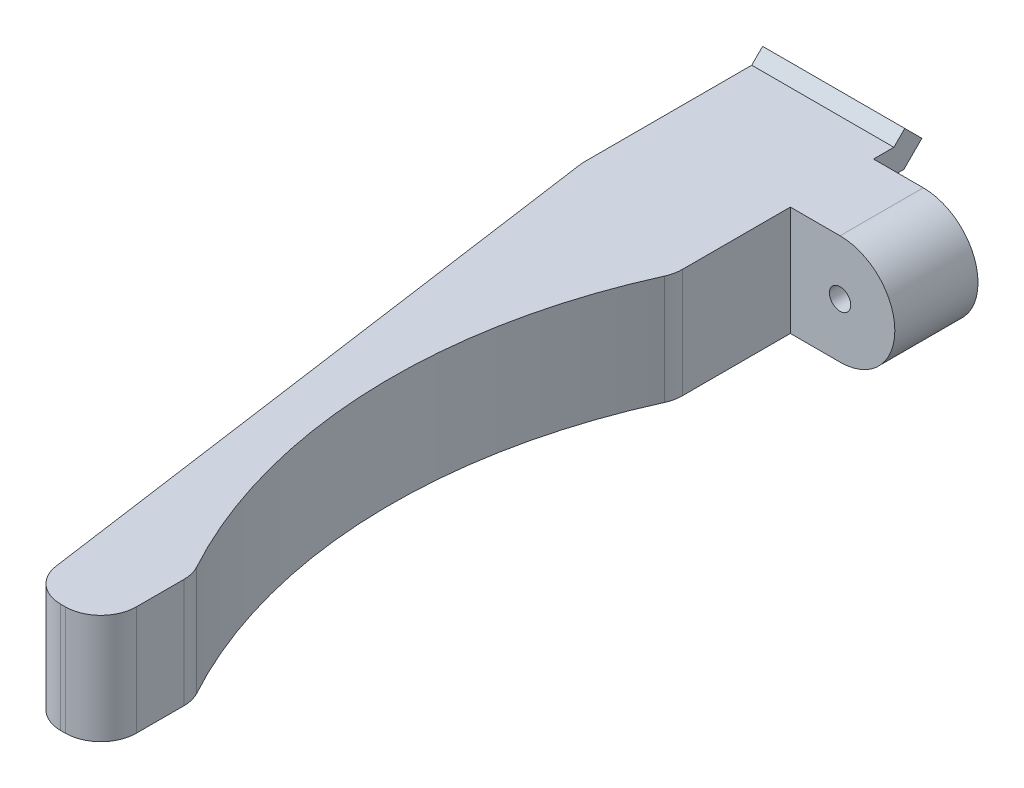
ISO-10303-21;
HEADER;
FILE_DESCRIPTION(('STEP AP214'),'2;1');
FILE_NAME('part.step','',(''),(''),'','','');
FILE_SCHEMA(('AUTOMOTIVE_DESIGN { 1 0 10303 214 1 1 1 1 }'));
ENDSEC;
DATA;
#1=APPLICATION_CONTEXT('core data for automotive mechanical design processes');
#2=APPLICATION_PROTOCOL_DEFINITION('international standard','automotive_design',2000,#1);
#3=PRODUCT_CONTEXT('',#1,'mechanical');
#4=PRODUCT('Part','Part','',(#3));
#5=PRODUCT_RELATED_PRODUCT_CATEGORY('part','',(#4));
#6=PRODUCT_DEFINITION_FORMATION('','',#4);
#7=PRODUCT_DEFINITION_CONTEXT('part definition',#1,'design');
#8=PRODUCT_DEFINITION('design','',#6,#7);
#9=PRODUCT_DEFINITION_SHAPE('','',#8);
#10=(LENGTH_UNIT() NAMED_UNIT(*) SI_UNIT(.MILLI.,.METRE.));
#11=(NAMED_UNIT(*) PLANE_ANGLE_UNIT() SI_UNIT($,.RADIAN.));
#12=(NAMED_UNIT(*) SI_UNIT($,.STERADIAN.) SOLID_ANGLE_UNIT());
#13=UNCERTAINTY_MEASURE_WITH_UNIT(LENGTH_MEASURE(1.E-05),#10,'distance_accuracy_value','');
#14=(GEOMETRIC_REPRESENTATION_CONTEXT(3) GLOBAL_UNCERTAINTY_ASSIGNED_CONTEXT((#13)) GLOBAL_UNIT_ASSIGNED_CONTEXT((#10,
#11,#12)) REPRESENTATION_CONTEXT('',''));
#15=CARTESIAN_POINT('',(0.,0.,0.));
#16=DIRECTION('',(0.,0.,1.));
#17=DIRECTION('',(1.,0.,0.));
#18=AXIS2_PLACEMENT_3D('',#15,#16,#17);
#19=CARTESIAN_POINT('',(5.,-7.38420621970652,-2.5));
#20=DIRECTION('',(-1.,0.,0.));
#21=DIRECTION('',(0.,0.,-1.));
#22=AXIS2_PLACEMENT_3D('',#19,#20,#21);
#23=PLANE('',#22);
#24=DIRECTION('',(0.,-1.,0.));
#25=VECTOR('',#24,1.);
#26=CARTESIAN_POINT('',(4.99999999999998,-2.80336880465984,-2.5));
#27=LINE('',#26,#25);
#28=CARTESIAN_POINT('',(5.,4.89663119534016,-2.5));
#29=VERTEX_POINT('',#28);
#30=CARTESIAN_POINT('',(5.,3.19663119534017,-2.5));
#31=VERTEX_POINT('',#30);
#32=EDGE_CURVE('E395',#29,#31,#27,.T.);
#33=ORIENTED_EDGE('',*,*,#32,.T.);
#34=DIRECTION('',(0.,0.,1.));
#35=VECTOR('',#34,1.);
#36=CARTESIAN_POINT('',(5.,3.19663119534017,-2.5));
#37=LINE('',#36,#35);
#38=CARTESIAN_POINT('',(5.,3.19663119534016,-4.63786796564135));
#39=VERTEX_POINT('',#38);
#40=EDGE_CURVE('E266',#39,#31,#37,.T.);
#41=ORIENTED_EDGE('',*,*,#40,.F.);
#42=DIRECTION('',(0.,-0.707106781186547,0.707106781186548));
#43=VECTOR('',#42,1.);
#44=CARTESIAN_POINT('',(5.,4.46084475771326,-5.90208152801444));
#45=LINE('',#44,#43);
#46=CARTESIAN_POINT('',(5.,4.46084475771326,-5.90208152801444));
#47=VERTEX_POINT('',#46);
#48=EDGE_CURVE('E263',#47,#39,#45,.T.);
#49=ORIENTED_EDGE('',*,*,#48,.F.);
#50=DIRECTION('',(0.,-0.707106781186548,-0.707106781186547));
#51=VECTOR('',#50,1.);
#52=CARTESIAN_POINT('',(5.,5.66292628573039,-4.69999999999731));
#53=LINE('',#52,#51);
#54=CARTESIAN_POINT('',(5.,5.66292628573039,-4.69999999999731));
#55=VERTEX_POINT('',#54);
#56=EDGE_CURVE('E260',#55,#47,#53,.T.);
#57=ORIENTED_EDGE('',*,*,#56,.F.);
#58=DIRECTION('',(0.,0.707106781186547,-0.707106781186547));
#59=VECTOR('',#58,1.);
#60=CARTESIAN_POINT('',(5.,4.89663119534016,-3.93370490960709));
#61=LINE('',#60,#59);
#62=CARTESIAN_POINT('',(5.,4.89663119534016,-3.93370490960709));
#63=VERTEX_POINT('',#62);
#64=EDGE_CURVE('E257',#63,#55,#61,.T.);
#65=ORIENTED_EDGE('',*,*,#64,.F.);
#66=DIRECTION('',(0.,0.,-1.));
#67=VECTOR('',#66,1.);
#68=CARTESIAN_POINT('',(5.,4.89663119534016,-2.64999999999731));
#69=LINE('',#68,#67);
#70=EDGE_CURVE('E239',#29,#63,#69,.T.);
#71=ORIENTED_EDGE('',*,*,#70,.F.);
#72=EDGE_LOOP('',(#33,#41,#49,#57,#65,#71));
#73=FACE_BOUND('',#72,.T.);
#74=ADVANCED_FACE('F37',(#73),#23,.F.);
#75=CARTESIAN_POINT('',(5.,-1.10336880465984,-2.5));
#76=VERTEX_POINT('',#75);
#77=CARTESIAN_POINT('',(5.,-2.80336880465984,-2.49999999999994));
#78=VERTEX_POINT('',#77);
#79=EDGE_CURVE('E386',#76,#78,#27,.T.);
#80=ORIENTED_EDGE('',*,*,#79,.T.);
#81=DIRECTION('',(0.,0.,1.));
#82=VECTOR('',#81,1.);
#83=CARTESIAN_POINT('',(5.,-2.80336880465984,-2.49999999999994));
#84=LINE('',#83,#82);
#85=CARTESIAN_POINT('',(5.,-2.80336880465984,-4.63786796564128));
#86=VERTEX_POINT('',#85);
#87=EDGE_CURVE('E217',#86,#78,#84,.T.);
#88=ORIENTED_EDGE('',*,*,#87,.F.);
#89=DIRECTION('',(0.,-0.707106781186547,0.707106781186548));
#90=VECTOR('',#89,1.);
#91=CARTESIAN_POINT('',(5.,-1.53915524228674,-5.90208152801438));
#92=LINE('',#91,#90);
#93=CARTESIAN_POINT('',(5.,-1.53915524228674,-5.90208152801438));
#94=VERTEX_POINT('',#93);
#95=EDGE_CURVE('E218',#94,#86,#92,.T.);
#96=ORIENTED_EDGE('',*,*,#95,.F.);
#97=DIRECTION('',(0.,-0.707106781186548,-0.707106781186547));
#98=VECTOR('',#97,1.);
#99=CARTESIAN_POINT('',(5.,-0.337073714269612,-4.69999999999725));
#100=LINE('',#99,#98);
#101=CARTESIAN_POINT('',(5.,-0.337073714269612,-4.69999999999725));
#102=VERTEX_POINT('',#101);
#103=EDGE_CURVE('E223',#102,#94,#100,.T.);
#104=ORIENTED_EDGE('',*,*,#103,.F.);
#105=DIRECTION('',(0.,0.707106781186547,-0.707106781186547));
#106=VECTOR('',#105,1.);
#107=CARTESIAN_POINT('',(5.,-1.10336880465984,-3.93370490960702));
#108=LINE('',#107,#106);
#109=CARTESIAN_POINT('',(5.,-1.10336880465984,-3.93370490960702));
#110=VERTEX_POINT('',#109);
#111=EDGE_CURVE('E360',#110,#102,#108,.T.);
#112=ORIENTED_EDGE('',*,*,#111,.F.);
#113=DIRECTION('',(0.,0.,-1.));
#114=VECTOR('',#113,1.);
#115=CARTESIAN_POINT('',(5.,-1.10336880465984,-2.64999999999725));
#116=LINE('',#115,#114);
#117=EDGE_CURVE('E342',#76,#110,#116,.T.);
#118=ORIENTED_EDGE('',*,*,#117,.F.);
#119=EDGE_LOOP('',(#80,#88,#96,#104,#112,#118));
#120=FACE_BOUND('',#119,.T.);
#121=ADVANCED_FACE('F371',(#120),#23,.F.);
#122=CARTESIAN_POINT('',(0.,0.,-2.5));
#123=DIRECTION('',(0.,0.,1.));
#124=DIRECTION('',(-1.,0.,0.));
#125=AXIS2_PLACEMENT_3D('',#122,#123,#124);
#126=PLANE('',#125);
#127=DIRECTION('',(0.,-1.,0.));
#128=VECTOR('',#127,1.);
#129=CARTESIAN_POINT('',(-5.,-7.38420621970652,-2.5));
#130=LINE('',#129,#128);
#131=CARTESIAN_POINT('',(-5.,3.19663119534017,-2.5));
#132=VERTEX_POINT('',#131);
#133=CARTESIAN_POINT('',(-5.,-1.10336880465984,-2.5));
#134=VERTEX_POINT('',#133);
#135=EDGE_CURVE('E280',#132,#134,#130,.T.);
#136=ORIENTED_EDGE('',*,*,#135,.F.);
#137=DIRECTION('',(1.,0.,0.));
#138=VECTOR('',#137,1.);
#139=CARTESIAN_POINT('',(-9.20199597764443,3.19663119534017,-2.5));
#140=LINE('',#139,#138);
#141=EDGE_CURVE('E245',#132,#31,#140,.T.);
#142=ORIENTED_EDGE('',*,*,#141,.T.);
#143=ORIENTED_EDGE('',*,*,#32,.F.);
#144=DIRECTION('',(-1.,0.,0.));
#145=VECTOR('',#144,1.);
#146=CARTESIAN_POINT('',(5.,4.89663119534016,-2.5));
#147=LINE('',#146,#145);
#148=CARTESIAN_POINT('',(8.49999999999998,4.89663119534016,-2.5));
#149=VERTEX_POINT('',#148);
#150=EDGE_CURVE('E213',#149,#29,#147,.T.);
#151=ORIENTED_EDGE('',*,*,#150,.F.);
#152=CARTESIAN_POINT('',(8.49999999999998,1.04663119534016,-2.5));
#153=DIRECTION('',(0.,0.,1.));
#154=DIRECTION('',(-1.,0.,0.));
#155=AXIS2_PLACEMENT_3D('',#152,#153,#154);
#156=CIRCLE('',#155,3.85);
#157=CARTESIAN_POINT('',(8.49999999999998,-2.80336880465984,-2.5));
#158=VERTEX_POINT('',#157);
#159=EDGE_CURVE('E406',#158,#149,#156,.T.);
#160=ORIENTED_EDGE('',*,*,#159,.F.);
#161=DIRECTION('',(1.,0.,0.));
#162=VECTOR('',#161,1.);
#163=CARTESIAN_POINT('',(8.49999999999999,-2.80336880465984,-2.5));
#164=LINE('',#163,#162);
#165=EDGE_CURVE('E394',#78,#158,#164,.T.);
#166=ORIENTED_EDGE('',*,*,#165,.F.);
#167=ORIENTED_EDGE('',*,*,#79,.F.);
#168=DIRECTION('',(1.,0.,0.));
#169=VECTOR('',#168,1.);
#170=CARTESIAN_POINT('',(-9.20199597764443,-1.10336880465984,-2.49999999999994));
#171=LINE('',#170,#169);
#172=EDGE_CURVE('E221',#134,#76,#171,.T.);
#173=ORIENTED_EDGE('',*,*,#172,.F.);
#174=EDGE_LOOP('',(#136,#142,#143,#151,#160,#166,#167,#173));
#175=FACE_BOUND('',#174,.T.);
#176=CARTESIAN_POINT('',(8.49999999999998,1.04663119534016,-2.5));
#177=DIRECTION('',(0.,0.,1.));
#178=DIRECTION('',(1.,0.,0.));
#179=AXIS2_PLACEMENT_3D('',#176,#177,#178);
#180=CIRCLE('',#179,0.75);
#181=CARTESIAN_POINT('',(9.24999999999998,1.04663119534016,-2.5));
#182=VERTEX_POINT('',#181);
#183=EDGE_CURVE('E400',#182,#182,#180,.T.);
#184=ORIENTED_EDGE('',*,*,#183,.T.);
#185=EDGE_LOOP('',(#184));
#186=FACE_BOUND('',#185,.T.);
#187=ADVANCED_FACE('F391',(#175,#186),#126,.F.);
#188=CARTESIAN_POINT('',(4.99999999999998,-2.80336880465984,3.35));
#189=VERTEX_POINT('',#188);
#190=CARTESIAN_POINT('',(5.,-2.80336880465987,10.9501334916828));
#191=VERTEX_POINT('',#190);
#192=EDGE_CURVE('E199',#189,#191,#84,.T.);
#193=ORIENTED_EDGE('',*,*,#192,.F.);
#194=DIRECTION('',(0.,-1.,0.));
#195=VECTOR('',#194,1.);
#196=CARTESIAN_POINT('',(4.99999999999998,-2.80336880465984,3.35));
#197=LINE('',#196,#195);
#198=CARTESIAN_POINT('',(5.,4.89663119534016,3.35));
#199=VERTEX_POINT('',#198);
#200=EDGE_CURVE('E204',#199,#189,#197,.T.);
#201=ORIENTED_EDGE('',*,*,#200,.F.);
#202=CARTESIAN_POINT('',(5.,4.89663119534016,10.9501334916829));
#203=VERTEX_POINT('',#202);
#204=EDGE_CURVE('E255',#203,#199,#69,.T.);
#205=ORIENTED_EDGE('',*,*,#204,.F.);
#206=DIRECTION('',(0.,1.,0.));
#207=VECTOR('',#206,1.);
#208=CARTESIAN_POINT('',(5.,4.89663119534017,10.9501334916829));
#209=LINE('',#208,#207);
#210=EDGE_CURVE('E11',#191,#203,#209,.T.);
#211=ORIENTED_EDGE('',*,*,#210,.F.);
#212=EDGE_LOOP('',(#193,#201,#205,#211));
#213=FACE_BOUND('',#212,.T.);
#214=ADVANCED_FACE('F216',(#213),#23,.F.);
#215=CARTESIAN_POINT('',(-5.,-7.38420621970652,-2.5));
#216=DIRECTION('',(1.,0.,0.));
#217=DIRECTION('',(0.,0.,1.));
#218=AXIS2_PLACEMENT_3D('',#215,#216,#217);
#219=PLANE('',#218);
#220=DIRECTION('',(0.,0.,1.));
#221=VECTOR('',#220,1.);
#222=CARTESIAN_POINT('',(-5.,4.89663119534016,-2.64999999999731));
#223=LINE('',#222,#221);
#224=CARTESIAN_POINT('',(-5.,4.89663119534016,-3.93370490960709));
#225=VERTEX_POINT('',#224);
#226=CARTESIAN_POINT('',(-5.,4.89663119534016,8.00000000000017));
#227=VERTEX_POINT('',#226);
#228=EDGE_CURVE('E254',#225,#227,#223,.T.);
#229=ORIENTED_EDGE('',*,*,#228,.F.);
#230=DIRECTION('',(0.,-0.707106781186548,0.707106781186548));
#231=VECTOR('',#230,1.);
#232=CARTESIAN_POINT('',(-5.,4.89663119534016,-3.93370490960709));
#233=LINE('',#232,#231);
#234=CARTESIAN_POINT('',(-5.,5.66292628573039,-4.69999999999731));
#235=VERTEX_POINT('',#234);
#236=EDGE_CURVE('E241',#235,#225,#233,.T.);
#237=ORIENTED_EDGE('',*,*,#236,.F.);
#238=DIRECTION('',(0.,0.707106781186548,0.707106781186547));
#239=VECTOR('',#238,1.);
#240=CARTESIAN_POINT('',(-5.,5.66292628573039,-4.69999999999731));
#241=LINE('',#240,#239);
#242=CARTESIAN_POINT('',(-5.,4.46084475771326,-5.90208152801444));
#243=VERTEX_POINT('',#242);
#244=EDGE_CURVE('E244',#243,#235,#241,.T.);
#245=ORIENTED_EDGE('',*,*,#244,.F.);
#246=DIRECTION('',(0.,0.707106781186547,-0.707106781186548));
#247=VECTOR('',#246,1.);
#248=CARTESIAN_POINT('',(-5.,4.46084475771326,-5.90208152801444));
#249=LINE('',#248,#247);
#250=CARTESIAN_POINT('',(-5.,3.19663119534017,-4.63786796564135));
#251=VERTEX_POINT('',#250);
#252=EDGE_CURVE('E248',#251,#243,#249,.T.);
#253=ORIENTED_EDGE('',*,*,#252,.F.);
#254=DIRECTION('',(0.,0.,-1.));
#255=VECTOR('',#254,1.);
#256=CARTESIAN_POINT('',(-5.,3.19663119534017,-2.5));
#257=LINE('',#256,#255);
#258=EDGE_CURVE('E251',#132,#251,#257,.T.);
#259=ORIENTED_EDGE('',*,*,#258,.F.);
#260=ORIENTED_EDGE('',*,*,#135,.T.);
#261=DIRECTION('',(0.,0.,1.));
#262=VECTOR('',#261,1.);
#263=CARTESIAN_POINT('',(-5.,-1.10336880465984,-2.64999999999725));
#264=LINE('',#263,#262);
#265=CARTESIAN_POINT('',(-5.,-1.10336880465984,-3.93370490960702));
#266=VERTEX_POINT('',#265);
#267=EDGE_CURVE('E237',#266,#134,#264,.T.);
#268=ORIENTED_EDGE('',*,*,#267,.F.);
#269=DIRECTION('',(0.,-0.707106781186548,0.707106781186548));
#270=VECTOR('',#269,1.);
#271=CARTESIAN_POINT('',(-5.,-1.10336880465984,-3.93370490960702));
#272=LINE('',#271,#270);
#273=CARTESIAN_POINT('',(-5.,-0.337073714269613,-4.69999999999725));
#274=VERTEX_POINT('',#273);
#275=EDGE_CURVE('E229',#274,#266,#272,.T.);
#276=ORIENTED_EDGE('',*,*,#275,.F.);
#277=DIRECTION('',(0.,0.707106781186548,0.707106781186547));
#278=VECTOR('',#277,1.);
#279=CARTESIAN_POINT('',(-5.,-0.337073714269612,-4.69999999999725));
#280=LINE('',#279,#278);
#281=CARTESIAN_POINT('',(-5.,-1.53915524228674,-5.90208152801438));
#282=VERTEX_POINT('',#281);
#283=EDGE_CURVE('E350',#282,#274,#280,.T.);
#284=ORIENTED_EDGE('',*,*,#283,.F.);
#285=DIRECTION('',(0.,0.707106781186547,-0.707106781186548));
#286=VECTOR('',#285,1.);
#287=CARTESIAN_POINT('',(-5.,-1.53915524228674,-5.90208152801438));
#288=LINE('',#287,#286);
#289=CARTESIAN_POINT('',(-5.,-2.80336880465984,-4.63786796564128));
#290=VERTEX_POINT('',#289);
#291=EDGE_CURVE('E353',#290,#282,#288,.T.);
#292=ORIENTED_EDGE('',*,*,#291,.F.);
#293=DIRECTION('',(0.,0.,-1.));
#294=VECTOR('',#293,1.);
#295=CARTESIAN_POINT('',(-5.,-2.80336880465984,-2.49999999999994));
#296=LINE('',#295,#294);
#297=CARTESIAN_POINT('',(-5.,-2.80336880465987,8.));
#298=VERTEX_POINT('',#297);
#299=EDGE_CURVE('E240',#298,#290,#296,.T.);
#300=ORIENTED_EDGE('',*,*,#299,.F.);
#301=DIRECTION('',(0.,-1.,0.));
#302=VECTOR('',#301,1.);
#303=CARTESIAN_POINT('',(-5.,56.8520738748096,8.00000000000017));
#304=LINE('',#303,#302);
#305=EDGE_CURVE('E325',#227,#298,#304,.T.);
#306=ORIENTED_EDGE('',*,*,#305,.F.);
#307=EDGE_LOOP('',(#229,#237,#245,#253,#259,#260,#268,#276,#284,#292,#300,#306));
#308=FACE_BOUND('',#307,.T.);
#309=ADVANCED_FACE('F380',(#308),#219,.F.);
#310=CARTESIAN_POINT('',(-9.20199597764443,3.19663119534017,-2.5));
#311=DIRECTION('',(0.,-1.,0.));
#312=DIRECTION('',(0.,0.,1.));
#313=AXIS2_PLACEMENT_3D('',#310,#311,#312);
#314=PLANE('',#313);
#315=ORIENTED_EDGE('',*,*,#258,.T.);
#316=DIRECTION('',(1.,0.,0.));
#317=VECTOR('',#316,1.);
#318=CARTESIAN_POINT('',(-9.20199597764443,3.19663119534016,-4.63786796564135));
#319=LINE('',#318,#317);
#320=EDGE_CURVE('E271',#251,#39,#319,.T.);
#321=ORIENTED_EDGE('',*,*,#320,.T.);
#322=ORIENTED_EDGE('',*,*,#40,.T.);
#323=ORIENTED_EDGE('',*,*,#141,.F.);
#324=EDGE_LOOP('',(#315,#321,#322,#323));
#325=FACE_BOUND('',#324,.T.);
#326=ADVANCED_FACE('F461',(#325),#314,.T.);
#327=CARTESIAN_POINT('',(-9.20199597764443,4.46084475771326,-5.90208152801444));
#328=DIRECTION('',(0.,-0.707106781186548,-0.707106781186547));
#329=DIRECTION('',(0.,-0.707106781186547,0.707106781186548));
#330=AXIS2_PLACEMENT_3D('',#327,#328,#329);
#331=PLANE('',#330);
#332=ORIENTED_EDGE('',*,*,#252,.T.);
#333=DIRECTION('',(1.,0.,0.));
#334=VECTOR('',#333,1.);
#335=CARTESIAN_POINT('',(-9.20199597764443,4.46084475771326,-5.90208152801444));
#336=LINE('',#335,#334);
#337=EDGE_CURVE('E273',#243,#47,#336,.T.);
#338=ORIENTED_EDGE('',*,*,#337,.T.);
#339=ORIENTED_EDGE('',*,*,#48,.T.);
#340=ORIENTED_EDGE('',*,*,#320,.F.);
#341=EDGE_LOOP('',(#332,#338,#339,#340));
#342=FACE_BOUND('',#341,.T.);
#343=ADVANCED_FACE('F475',(#342),#331,.T.);
#344=CARTESIAN_POINT('',(-9.20199597764443,5.66292628573039,-4.69999999999731));
#345=DIRECTION('',(0.,0.707106781186547,-0.707106781186548));
#346=DIRECTION('',(0.,-0.707106781186548,-0.707106781186547));
#347=AXIS2_PLACEMENT_3D('',#344,#345,#346);
#348=PLANE('',#347);
#349=ORIENTED_EDGE('',*,*,#244,.T.);
#350=DIRECTION('',(1.,0.,0.));
#351=VECTOR('',#350,1.);
#352=CARTESIAN_POINT('',(-9.20199597764443,5.66292628573039,-4.69999999999731));
#353=LINE('',#352,#351);
#354=EDGE_CURVE('E275',#235,#55,#353,.T.);
#355=ORIENTED_EDGE('',*,*,#354,.T.);
#356=ORIENTED_EDGE('',*,*,#56,.T.);
#357=ORIENTED_EDGE('',*,*,#337,.F.);
#358=EDGE_LOOP('',(#349,#355,#356,#357));
#359=FACE_BOUND('',#358,.T.);
#360=ADVANCED_FACE('F471',(#359),#348,.T.);
#361=CARTESIAN_POINT('',(-9.20199597764443,4.89663119534016,-3.93370490960709));
#362=DIRECTION('',(0.,0.707106781186547,0.707106781186547));
#363=DIRECTION('',(0.,0.707106781186548,-0.707106781186548));
#364=AXIS2_PLACEMENT_3D('',#361,#362,#363);
#365=PLANE('',#364);
#366=ORIENTED_EDGE('',*,*,#236,.T.);
#367=DIRECTION('',(1.,0.,0.));
#368=VECTOR('',#367,1.);
#369=CARTESIAN_POINT('',(-9.20199597764443,4.89663119534016,-3.93370490960709));
#370=LINE('',#369,#368);
#371=EDGE_CURVE('E269',#225,#63,#370,.T.);
#372=ORIENTED_EDGE('',*,*,#371,.T.);
#373=ORIENTED_EDGE('',*,*,#64,.T.);
#374=ORIENTED_EDGE('',*,*,#354,.F.);
#375=EDGE_LOOP('',(#366,#372,#373,#374));
#376=FACE_BOUND('',#375,.T.);
#377=ADVANCED_FACE('F468',(#376),#365,.T.);
#378=CARTESIAN_POINT('',(-9.20199597764443,4.89663119534016,-2.64999999999731));
#379=DIRECTION('',(0.,1.,0.));
#380=DIRECTION('',(0.,0.,-1.));
#381=AXIS2_PLACEMENT_3D('',#378,#379,#380);
#382=PLANE('',#381);
#383=DIRECTION('',(1.,0.,0.));
#384=VECTOR('',#383,1.);
#385=CARTESIAN_POINT('',(1.35244572854812,4.89663119534016,53.2));
#386=LINE('',#385,#384);
#387=CARTESIAN_POINT('',(3.52566257308868,4.89663119534016,53.2));
#388=VERTEX_POINT('',#387);
#389=CARTESIAN_POINT('',(3.85244572854812,4.89663119534016,53.2));
#390=VERTEX_POINT('',#389);
#391=EDGE_CURVE('E340',#388,#390,#386,.T.);
#392=ORIENTED_EDGE('',*,*,#391,.T.);
#393=CARTESIAN_POINT('',(3.85244572854812,4.89663119534017,50.7));
#394=DIRECTION('',(0.,-1.,0.));
#395=DIRECTION('',(0.,0.,-1.));
#396=AXIS2_PLACEMENT_3D('',#393,#394,#395);
#397=CIRCLE('',#396,2.5);
#398=CARTESIAN_POINT('',(6.35244572854812,4.89663119534016,50.7));
#399=VERTEX_POINT('',#398);
#400=EDGE_CURVE('E304',#399,#390,#397,.T.);
#401=ORIENTED_EDGE('',*,*,#400,.F.);
#402=DIRECTION('',(0.,0.,-1.));
#403=VECTOR('',#402,1.);
#404=CARTESIAN_POINT('',(6.35244572854812,4.89663119534016,53.2000000000002));
#405=LINE('',#404,#403);
#406=CARTESIAN_POINT('',(6.35244572854812,4.89663119534016,47.3497116646296));
#407=VERTEX_POINT('',#406);
#408=EDGE_CURVE('E326',#399,#407,#405,.T.);
#409=ORIENTED_EDGE('',*,*,#408,.T.);
#410=CARTESIAN_POINT('',(3.85244572854811,4.89663119534017,47.3497116646296));
#411=DIRECTION('',(0.,-1.,0.));
#412=DIRECTION('',(0.,0.,-1.));
#413=AXIS2_PLACEMENT_3D('',#410,#411,#412);
#414=CIRCLE('',#413,2.5);
#415=CARTESIAN_POINT('',(6.04589541498277,4.89663119534017,46.1502207421631));
#416=VERTEX_POINT('',#415);
#417=EDGE_CURVE('E302',#416,#407,#414,.T.);
#418=ORIENTED_EDGE('',*,*,#417,.F.);
#419=CARTESIAN_POINT('',(39.6088986863946,4.89663119534017,27.7962470888115));
#420=DIRECTION('',(0.,-1.,0.));
#421=DIRECTION('',(0.,0.,-1.));
#422=AXIS2_PLACEMENT_3D('',#419,#420,#421);
#423=CIRCLE('',#422,38.2536735159477);
#424=CARTESIAN_POINT('',(4.77641433795368,4.89663119534017,11.9835442338173));
#425=VERTEX_POINT('',#424);
#426=EDGE_CURVE('E322',#416,#425,#423,.T.);
#427=ORIENTED_EDGE('',*,*,#426,.T.);
#428=CARTESIAN_POINT('',(2.5,4.89663119534016,10.9501334916829));
#429=DIRECTION('',(0.,-1.,0.));
#430=DIRECTION('',(0.,0.,-1.));
#431=AXIS2_PLACEMENT_3D('',#428,#429,#430);
#432=CIRCLE('',#431,2.5);
#433=EDGE_CURVE('E299',#203,#425,#432,.T.);
#434=ORIENTED_EDGE('',*,*,#433,.F.);
#435=ORIENTED_EDGE('',*,*,#204,.T.);
#436=DIRECTION('',(-1.,0.,0.));
#437=VECTOR('',#436,1.);
#438=CARTESIAN_POINT('',(5.,4.89663119534016,3.35));
#439=LINE('',#438,#437);
#440=CARTESIAN_POINT('',(8.49999999999998,4.89663119534016,3.35));
#441=VERTEX_POINT('',#440);
#442=EDGE_CURVE('E209',#441,#199,#439,.T.);
#443=ORIENTED_EDGE('',*,*,#442,.F.);
#444=DIRECTION('',(0.,0.,-1.));
#445=VECTOR('',#444,1.);
#446=CARTESIAN_POINT('',(8.49999999999998,4.89663119534016,3.35));
#447=LINE('',#446,#445);
#448=EDGE_CURVE('E410',#441,#149,#447,.T.);
#449=ORIENTED_EDGE('',*,*,#448,.T.);
#450=ORIENTED_EDGE('',*,*,#150,.T.);
#451=ORIENTED_EDGE('',*,*,#70,.T.);
#452=ORIENTED_EDGE('',*,*,#371,.F.);
#453=ORIENTED_EDGE('',*,*,#228,.T.);
#454=DIRECTION('',(0.139173100960066,0.,0.99026806874157));
#455=VECTOR('',#454,1.);
#456=CARTESIAN_POINT('',(-4.99999999999998,4.89663119534017,8.00000000000017));
#457=LINE('',#456,#455);
#458=CARTESIAN_POINT('',(1.04999240123476,4.89663119534017,51.0479327524002));
#459=VERTEX_POINT('',#458);
#460=EDGE_CURVE('E343',#227,#459,#457,.T.);
#461=ORIENTED_EDGE('',*,*,#460,.T.);
#462=CARTESIAN_POINT('',(3.52566257308868,4.89663119534017,50.7));
#463=DIRECTION('',(0.,-1.,0.));
#464=DIRECTION('',(0.,0.,-1.));
#465=AXIS2_PLACEMENT_3D('',#462,#463,#464);
#466=CIRCLE('',#465,2.5);
#467=EDGE_CURVE('E306',#388,#459,#466,.T.);
#468=ORIENTED_EDGE('',*,*,#467,.F.);
#469=EDGE_LOOP('',(#392,#401,#409,#418,#427,#434,#435,#443,#449,#450,#451,#452,#453,#461,#468));
#470=FACE_BOUND('',#469,.T.);
#471=ADVANCED_FACE('F329',(#470),#382,.T.);
#472=CARTESIAN_POINT('',(-9.20199597764443,-2.80336880465984,-2.49999999999994));
#473=DIRECTION('',(0.,-1.,0.));
#474=DIRECTION('',(0.,0.,1.));
#475=AXIS2_PLACEMENT_3D('',#472,#473,#474);
#476=PLANE('',#475);
#477=DIRECTION('',(0.139173100960066,0.,0.99026806874157));
#478=VECTOR('',#477,1.);
#479=CARTESIAN_POINT('',(-5.,-2.80336880465987,8.));
#480=LINE('',#479,#478);
#481=CARTESIAN_POINT('',(1.04999240123476,-2.80336880465999,51.0479327524002));
#482=VERTEX_POINT('',#481);
#483=EDGE_CURVE('E331',#298,#482,#480,.T.);
#484=ORIENTED_EDGE('',*,*,#483,.F.);
#485=ORIENTED_EDGE('',*,*,#299,.T.);
#486=DIRECTION('',(1.,0.,0.));
#487=VECTOR('',#486,1.);
#488=CARTESIAN_POINT('',(-9.20199597764443,-2.80336880465984,-4.63786796564128));
#489=LINE('',#488,#487);
#490=EDGE_CURVE('E227',#290,#86,#489,.T.);
#491=ORIENTED_EDGE('',*,*,#490,.T.);
#492=ORIENTED_EDGE('',*,*,#87,.T.);
#493=ORIENTED_EDGE('',*,*,#165,.T.);
#494=DIRECTION('',(0.,0.,-1.));
#495=VECTOR('',#494,1.);
#496=CARTESIAN_POINT('',(8.49999999999998,-2.80336880465984,3.35));
#497=LINE('',#496,#495);
#498=CARTESIAN_POINT('',(8.49999999999998,-2.80336880465984,3.35));
#499=VERTEX_POINT('',#498);
#500=EDGE_CURVE('E201',#499,#158,#497,.T.);
#501=ORIENTED_EDGE('',*,*,#500,.F.);
#502=DIRECTION('',(1.,0.,0.));
#503=VECTOR('',#502,1.);
#504=CARTESIAN_POINT('',(8.49999999999999,-2.80336880465984,3.35));
#505=LINE('',#504,#503);
#506=EDGE_CURVE('E194',#189,#499,#505,.T.);
#507=ORIENTED_EDGE('',*,*,#506,.F.);
#508=ORIENTED_EDGE('',*,*,#192,.T.);
#509=CARTESIAN_POINT('',(2.5,-2.80336880465987,10.9501334916828));
#510=DIRECTION('',(0.,1.,0.));
#511=DIRECTION('',(0.,0.,1.));
#512=AXIS2_PLACEMENT_3D('',#509,#510,#511);
#513=CIRCLE('',#512,2.5);
#514=CARTESIAN_POINT('',(4.77641433795368,-2.80336880465988,11.9835442338173));
#515=VERTEX_POINT('',#514);
#516=EDGE_CURVE('E285',#515,#191,#513,.T.);
#517=ORIENTED_EDGE('',*,*,#516,.F.);
#518=CARTESIAN_POINT('',(39.6088986863946,-2.80336880465992,27.7962470888115));
#519=DIRECTION('',(0.,-1.,0.));
#520=DIRECTION('',(0.,0.,1.));
#521=AXIS2_PLACEMENT_3D('',#518,#519,#520);
#522=CIRCLE('',#521,38.2536735159477);
#523=CARTESIAN_POINT('',(6.04589541498278,-2.80336880465998,46.1502207421631));
#524=VERTEX_POINT('',#523);
#525=EDGE_CURVE('E334',#524,#515,#522,.T.);
#526=ORIENTED_EDGE('',*,*,#525,.F.);
#527=CARTESIAN_POINT('',(3.85244572854811,-2.80336880465998,47.3497116646296));
#528=DIRECTION('',(0.,1.,0.));
#529=DIRECTION('',(0.,0.,1.));
#530=AXIS2_PLACEMENT_3D('',#527,#528,#529);
#531=CIRCLE('',#530,2.5);
#532=CARTESIAN_POINT('',(6.35244572854812,-2.80336880465998,47.3497116646296));
#533=VERTEX_POINT('',#532);
#534=EDGE_CURVE('E287',#533,#524,#531,.T.);
#535=ORIENTED_EDGE('',*,*,#534,.F.);
#536=DIRECTION('',(0.,0.,-1.));
#537=VECTOR('',#536,1.);
#538=CARTESIAN_POINT('',(6.35244572854812,-2.80336880466,53.2));
#539=LINE('',#538,#537);
#540=CARTESIAN_POINT('',(6.35244572854812,-2.80336880465999,50.7));
#541=VERTEX_POINT('',#540);
#542=EDGE_CURVE('E413',#541,#533,#539,.T.);
#543=ORIENTED_EDGE('',*,*,#542,.F.);
#544=CARTESIAN_POINT('',(3.85244572854812,-2.80336880465999,50.7));
#545=DIRECTION('',(0.,1.,0.));
#546=DIRECTION('',(0.,0.,1.));
#547=AXIS2_PLACEMENT_3D('',#544,#545,#546);
#548=CIRCLE('',#547,2.5);
#549=CARTESIAN_POINT('',(3.85244572854812,-2.80336880466,53.2));
#550=VERTEX_POINT('',#549);
#551=EDGE_CURVE('E290',#550,#541,#548,.T.);
#552=ORIENTED_EDGE('',*,*,#551,.F.);
#553=DIRECTION('',(1.,0.,0.));
#554=VECTOR('',#553,1.);
#555=CARTESIAN_POINT('',(1.35244572854812,-2.80336880466,53.2));
#556=LINE('',#555,#554);
#557=CARTESIAN_POINT('',(3.52566257308868,-2.80336880466,53.2));
#558=VERTEX_POINT('',#557);
#559=EDGE_CURVE('E338',#558,#550,#556,.T.);
#560=ORIENTED_EDGE('',*,*,#559,.F.);
#561=CARTESIAN_POINT('',(3.52566257308868,-2.80336880465999,50.7));
#562=DIRECTION('',(0.,1.,0.));
#563=DIRECTION('',(0.,0.,1.));
#564=AXIS2_PLACEMENT_3D('',#561,#562,#563);
#565=CIRCLE('',#564,2.5);
#566=EDGE_CURVE('E292',#482,#558,#565,.T.);
#567=ORIENTED_EDGE('',*,*,#566,.F.);
#568=EDGE_LOOP('',(#484,#485,#491,#492,#493,#501,#507,#508,#517,#526,#535,#543,#552,#560,#567));
#569=FACE_BOUND('',#568,.T.);
#570=ADVANCED_FACE('F196',(#569),#476,.T.);
#571=CARTESIAN_POINT('',(-9.20199597764443,-1.53915524228674,-5.90208152801438));
#572=DIRECTION('',(0.,-0.707106781186548,-0.707106781186547));
#573=DIRECTION('',(0.,-0.707106781186547,0.707106781186548));
#574=AXIS2_PLACEMENT_3D('',#571,#572,#573);
#575=PLANE('',#574);
#576=ORIENTED_EDGE('',*,*,#291,.T.);
#577=DIRECTION('',(1.,0.,0.));
#578=VECTOR('',#577,1.);
#579=CARTESIAN_POINT('',(-9.20199597764443,-1.53915524228674,-5.90208152801438));
#580=LINE('',#579,#578);
#581=EDGE_CURVE('E230',#282,#94,#580,.T.);
#582=ORIENTED_EDGE('',*,*,#581,.T.);
#583=ORIENTED_EDGE('',*,*,#95,.T.);
#584=ORIENTED_EDGE('',*,*,#490,.F.);
#585=EDGE_LOOP('',(#576,#582,#583,#584));
#586=FACE_BOUND('',#585,.T.);
#587=ADVANCED_FACE('F373',(#586),#575,.T.);
#588=CARTESIAN_POINT('',(-9.20199597764443,-0.337073714269612,-4.69999999999725));
#589=DIRECTION('',(0.,0.707106781186547,-0.707106781186548));
#590=DIRECTION('',(0.,-0.707106781186548,-0.707106781186547));
#591=AXIS2_PLACEMENT_3D('',#588,#589,#590);
#592=PLANE('',#591);
#593=ORIENTED_EDGE('',*,*,#283,.T.);
#594=DIRECTION('',(1.,0.,0.));
#595=VECTOR('',#594,1.);
#596=CARTESIAN_POINT('',(-9.20199597764443,-0.337073714269612,-4.69999999999725));
#597=LINE('',#596,#595);
#598=EDGE_CURVE('E232',#274,#102,#597,.T.);
#599=ORIENTED_EDGE('',*,*,#598,.T.);
#600=ORIENTED_EDGE('',*,*,#103,.T.);
#601=ORIENTED_EDGE('',*,*,#581,.F.);
#602=EDGE_LOOP('',(#593,#599,#600,#601));
#603=FACE_BOUND('',#602,.T.);
#604=ADVANCED_FACE('F366',(#603),#592,.T.);
#605=CARTESIAN_POINT('',(-9.20199597764443,-1.10336880465984,-3.93370490960702));
#606=DIRECTION('',(0.,0.707106781186547,0.707106781186547));
#607=DIRECTION('',(0.,0.707106781186548,-0.707106781186548));
#608=AXIS2_PLACEMENT_3D('',#605,#606,#607);
#609=PLANE('',#608);
#610=ORIENTED_EDGE('',*,*,#275,.T.);
#611=DIRECTION('',(1.,0.,0.));
#612=VECTOR('',#611,1.);
#613=CARTESIAN_POINT('',(-9.20199597764443,-1.10336880465984,-3.93370490960702));
#614=LINE('',#613,#612);
#615=EDGE_CURVE('E234',#266,#110,#614,.T.);
#616=ORIENTED_EDGE('',*,*,#615,.T.);
#617=ORIENTED_EDGE('',*,*,#111,.T.);
#618=ORIENTED_EDGE('',*,*,#598,.F.);
#619=EDGE_LOOP('',(#610,#616,#617,#618));
#620=FACE_BOUND('',#619,.T.);
#621=ADVANCED_FACE('F383',(#620),#609,.T.);
#622=CARTESIAN_POINT('',(-9.20199597764443,-1.10336880465984,-2.64999999999725));
#623=DIRECTION('',(0.,1.,0.));
#624=DIRECTION('',(0.,0.,-1.));
#625=AXIS2_PLACEMENT_3D('',#622,#623,#624);
#626=PLANE('',#625);
#627=ORIENTED_EDGE('',*,*,#267,.T.);
#628=ORIENTED_EDGE('',*,*,#172,.T.);
#629=ORIENTED_EDGE('',*,*,#117,.T.);
#630=ORIENTED_EDGE('',*,*,#615,.F.);
#631=EDGE_LOOP('',(#627,#628,#629,#630));
#632=FACE_BOUND('',#631,.T.);
#633=ADVANCED_FACE('F483',(#632),#626,.T.);
#634=CARTESIAN_POINT('',(6.35244572854812,56.8520738748095,53.2000000000002));
#635=DIRECTION('',(1.,0.,0.));
#636=DIRECTION('',(0.,0.,1.));
#637=AXIS2_PLACEMENT_3D('',#634,#635,#636);
#638=PLANE('',#637);
#639=ORIENTED_EDGE('',*,*,#542,.T.);
#640=DIRECTION('',(0.,-1.,0.));
#641=VECTOR('',#640,1.);
#642=CARTESIAN_POINT('',(6.35244572854812,56.8520738748095,47.3497116646298));
#643=LINE('',#642,#641);
#644=EDGE_CURVE('E52',#407,#533,#643,.T.);
#645=ORIENTED_EDGE('',*,*,#644,.F.);
#646=ORIENTED_EDGE('',*,*,#408,.F.);
#647=DIRECTION('',(0.,-1.,0.));
#648=VECTOR('',#647,1.);
#649=CARTESIAN_POINT('',(6.35244572854812,56.8520738748095,50.7000000000002));
#650=LINE('',#649,#648);
#651=EDGE_CURVE('E60',#541,#399,#650,.F.);
#652=ORIENTED_EDGE('',*,*,#651,.F.);
#653=EDGE_LOOP('',(#639,#645,#646,#652));
#654=FACE_BOUND('',#653,.T.);
#655=ADVANCED_FACE('F486',(#654),#638,.T.);
#656=CARTESIAN_POINT('',(39.6088986863946,56.8520738748096,27.7962470888117));
#657=DIRECTION('',(0.,-1.,0.));
#658=DIRECTION('',(0.,0.,1.));
#659=AXIS2_PLACEMENT_3D('',#656,#657,#658);
#660=CYLINDRICAL_SURFACE('',#659,38.2536735159477);
#661=ORIENTED_EDGE('',*,*,#525,.T.);
#662=DIRECTION('',(0.,-1.,0.));
#663=VECTOR('',#662,1.);
#664=CARTESIAN_POINT('',(4.77641433795367,56.8520738748096,11.9835442338175));
#665=LINE('',#664,#663);
#666=EDGE_CURVE('E311',#425,#515,#665,.T.);
#667=ORIENTED_EDGE('',*,*,#666,.F.);
#668=ORIENTED_EDGE('',*,*,#426,.F.);
#669=DIRECTION('',(0.,-1.,0.));
#670=VECTOR('',#669,1.);
#671=CARTESIAN_POINT('',(6.04589541498277,56.8520738748095,46.1502207421632));
#672=LINE('',#671,#670);
#673=EDGE_CURVE('E45',#524,#416,#672,.F.);
#674=ORIENTED_EDGE('',*,*,#673,.F.);
#675=EDGE_LOOP('',(#661,#667,#668,#674));
#676=FACE_BOUND('',#675,.T.);
#677=ADVANCED_FACE('F323',(#676),#660,.F.);
#678=CARTESIAN_POINT('',(-5.,56.8520738748096,8.00000000000017));
#679=DIRECTION('',(-0.99026806874157,0.,0.139173100960066));
#680=DIRECTION('',(-0.139173100960066,0.,-0.99026806874157));
#681=AXIS2_PLACEMENT_3D('',#678,#679,#680);
#682=PLANE('',#681);
#683=ORIENTED_EDGE('',*,*,#460,.F.);
#684=ORIENTED_EDGE('',*,*,#305,.T.);
#685=ORIENTED_EDGE('',*,*,#483,.T.);
#686=DIRECTION('',(0.,-1.,0.));
#687=VECTOR('',#686,1.);
#688=CARTESIAN_POINT('',(1.04999240123476,56.8520738748095,51.0479327524003));
#689=LINE('',#688,#687);
#690=EDGE_CURVE('E283',#459,#482,#689,.T.);
#691=ORIENTED_EDGE('',*,*,#690,.F.);
#692=EDGE_LOOP('',(#683,#684,#685,#691));
#693=FACE_BOUND('',#692,.T.);
#694=ADVANCED_FACE('F427',(#693),#682,.T.);
#695=CARTESIAN_POINT('',(1.35244572854812,56.8520738748095,53.2000000000002));
#696=DIRECTION('',(0.,0.,1.));
#697=DIRECTION('',(0.,1.,0.));
#698=AXIS2_PLACEMENT_3D('',#695,#696,#697);
#699=PLANE('',#698);
#700=ORIENTED_EDGE('',*,*,#559,.T.);
#701=DIRECTION('',(0.,-1.,0.));
#702=VECTOR('',#701,1.);
#703=CARTESIAN_POINT('',(3.85244572854812,56.8520738748095,53.2000000000002));
#704=LINE('',#703,#702);
#705=EDGE_CURVE('E295',#390,#550,#704,.T.);
#706=ORIENTED_EDGE('',*,*,#705,.F.);
#707=ORIENTED_EDGE('',*,*,#391,.F.);
#708=DIRECTION('',(0.,-1.,0.));
#709=VECTOR('',#708,1.);
#710=CARTESIAN_POINT('',(3.52566257308868,56.8520738748095,53.2000000000002));
#711=LINE('',#710,#709);
#712=EDGE_CURVE('E297',#558,#388,#711,.F.);
#713=ORIENTED_EDGE('',*,*,#712,.F.);
#714=EDGE_LOOP('',(#700,#706,#707,#713));
#715=FACE_BOUND('',#714,.T.);
#716=ADVANCED_FACE('F419',(#715),#699,.T.);
#717=CARTESIAN_POINT('',(8.49999999999998,1.04663119534016,3.35));
#718=DIRECTION('',(0.,0.,-1.));
#719=DIRECTION('',(1.,0.,0.));
#720=AXIS2_PLACEMENT_3D('',#717,#718,#719);
#721=CYLINDRICAL_SURFACE('',#720,3.85);
#722=ORIENTED_EDGE('',*,*,#159,.T.);
#723=ORIENTED_EDGE('',*,*,#448,.F.);
#724=CARTESIAN_POINT('',(8.49999999999998,1.04663119534016,3.35));
#725=DIRECTION('',(0.,0.,1.));
#726=DIRECTION('',(-1.,0.,0.));
#727=AXIS2_PLACEMENT_3D('',#724,#725,#726);
#728=CIRCLE('',#727,3.85);
#729=EDGE_CURVE('E203',#499,#441,#728,.T.);
#730=ORIENTED_EDGE('',*,*,#729,.F.);
#731=ORIENTED_EDGE('',*,*,#500,.T.);
#732=EDGE_LOOP('',(#722,#723,#730,#731));
#733=FACE_BOUND('',#732,.T.);
#734=ADVANCED_FACE('F433',(#733),#721,.T.);
#735=CARTESIAN_POINT('',(8.49999999999998,1.04663119534016,3.35));
#736=DIRECTION('',(0.,0.,1.));
#737=DIRECTION('',(-1.,0.,0.));
#738=AXIS2_PLACEMENT_3D('',#735,#736,#737);
#739=PLANE('',#738);
#740=CARTESIAN_POINT('',(8.49999999999998,1.04663119534016,3.35));
#741=DIRECTION('',(0.,0.,1.));
#742=DIRECTION('',(1.,0.,0.));
#743=AXIS2_PLACEMENT_3D('',#740,#741,#742);
#744=CIRCLE('',#743,0.75);
#745=CARTESIAN_POINT('',(9.24999999999998,1.04663119534016,3.35));
#746=VERTEX_POINT('',#745);
#747=EDGE_CURVE('E396',#746,#746,#744,.T.);
#748=ORIENTED_EDGE('',*,*,#747,.F.);
#749=EDGE_LOOP('',(#748));
#750=FACE_BOUND('',#749,.T.);
#751=ORIENTED_EDGE('',*,*,#200,.T.);
#752=ORIENTED_EDGE('',*,*,#506,.T.);
#753=ORIENTED_EDGE('',*,*,#729,.T.);
#754=ORIENTED_EDGE('',*,*,#442,.T.);
#755=EDGE_LOOP('',(#751,#752,#753,#754));
#756=FACE_BOUND('',#755,.T.);
#757=ADVANCED_FACE('F207',(#750,#756),#739,.T.);
#758=CARTESIAN_POINT('',(8.49999999999998,1.04663119534016,3.35));
#759=DIRECTION('',(0.,0.,-1.));
#760=DIRECTION('',(1.,0.,0.));
#761=AXIS2_PLACEMENT_3D('',#758,#759,#760);
#762=CYLINDRICAL_SURFACE('',#761,0.75);
#763=ORIENTED_EDGE('',*,*,#747,.T.);
#764=EDGE_LOOP('',(#763));
#765=FACE_BOUND('',#764,.T.);
#766=ORIENTED_EDGE('',*,*,#183,.F.);
#767=EDGE_LOOP('',(#766));
#768=FACE_BOUND('',#767,.T.);
#769=ADVANCED_FACE('F438',(#765,#768),#762,.F.);
#770=CARTESIAN_POINT('',(3.52566257308868,56.8520738748095,50.7000000000002));
#771=DIRECTION('',(0.,-1.,0.));
#772=DIRECTION('',(0.,0.,1.));
#773=AXIS2_PLACEMENT_3D('',#770,#771,#772);
#774=CYLINDRICAL_SURFACE('',#773,2.5);
#775=ORIENTED_EDGE('',*,*,#467,.T.);
#776=ORIENTED_EDGE('',*,*,#690,.T.);
#777=ORIENTED_EDGE('',*,*,#566,.T.);
#778=ORIENTED_EDGE('',*,*,#712,.T.);
#779=EDGE_LOOP('',(#775,#776,#777,#778));
#780=FACE_BOUND('',#779,.T.);
#781=ADVANCED_FACE('F425',(#780),#774,.T.);
#782=CARTESIAN_POINT('',(3.85244572854812,56.8520738748095,50.7000000000002));
#783=DIRECTION('',(0.,-1.,0.));
#784=DIRECTION('',(0.,0.,1.));
#785=AXIS2_PLACEMENT_3D('',#782,#783,#784);
#786=CYLINDRICAL_SURFACE('',#785,2.5);
#787=ORIENTED_EDGE('',*,*,#400,.T.);
#788=ORIENTED_EDGE('',*,*,#705,.T.);
#789=ORIENTED_EDGE('',*,*,#551,.T.);
#790=ORIENTED_EDGE('',*,*,#651,.T.);
#791=EDGE_LOOP('',(#787,#788,#789,#790));
#792=FACE_BOUND('',#791,.T.);
#793=ADVANCED_FACE('F422',(#792),#786,.T.);
#794=CARTESIAN_POINT('',(3.85244572854811,56.8520738748095,47.3497116646298));
#795=DIRECTION('',(0.,-1.,0.));
#796=DIRECTION('',(0.,0.,1.));
#797=AXIS2_PLACEMENT_3D('',#794,#795,#796);
#798=CYLINDRICAL_SURFACE('',#797,2.5);
#799=ORIENTED_EDGE('',*,*,#417,.T.);
#800=ORIENTED_EDGE('',*,*,#644,.T.);
#801=ORIENTED_EDGE('',*,*,#534,.T.);
#802=ORIENTED_EDGE('',*,*,#673,.T.);
#803=EDGE_LOOP('',(#799,#800,#801,#802));
#804=FACE_BOUND('',#803,.T.);
#805=ADVANCED_FACE('F314',(#804),#798,.T.);
#806=CARTESIAN_POINT('',(2.5,56.8520738748096,10.950133491683));
#807=DIRECTION('',(0.,-1.,0.));
#808=DIRECTION('',(0.,0.,1.));
#809=AXIS2_PLACEMENT_3D('',#806,#807,#808);
#810=CYLINDRICAL_SURFACE('',#809,2.5);
#811=ORIENTED_EDGE('',*,*,#433,.T.);
#812=ORIENTED_EDGE('',*,*,#666,.T.);
#813=ORIENTED_EDGE('',*,*,#516,.T.);
#814=ORIENTED_EDGE('',*,*,#210,.T.);
#815=EDGE_LOOP('',(#811,#812,#813,#814));
#816=FACE_BOUND('',#815,.T.);
#817=ADVANCED_FACE('F39',(#816),#810,.T.);
#818=CLOSED_SHELL('',(#74,#121,#187,#214,#309,#326,#343,#360,#377,#471,#570,#587,#604,#621,#633,
#655,#677,#694,#716,#734,#757,#769,#781,#793,#805,#817));
#819=MANIFOLD_SOLID_BREP('B2',#818);
#820=ADVANCED_BREP_SHAPE_REPRESENTATION('',(#18,#819),#14);
#821=SHAPE_DEFINITION_REPRESENTATION(#9,#820);
ENDSEC;
END-ISO-10303-21;
